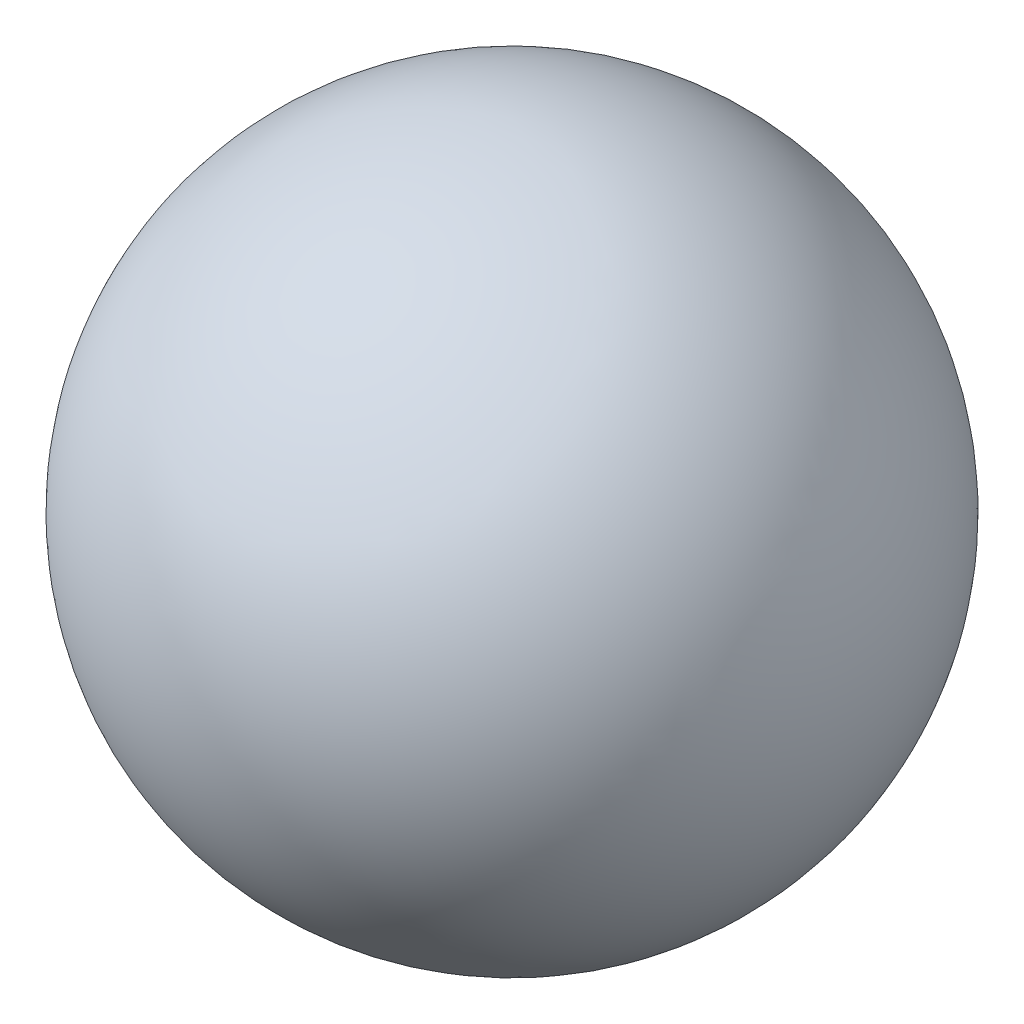
ISO-10303-21;
HEADER;
FILE_DESCRIPTION(('STEP AP214'),'2;1');
FILE_NAME('part.step','',(''),(''),'','','');
FILE_SCHEMA(('AUTOMOTIVE_DESIGN { 1 0 10303 214 1 1 1 1 }'));
ENDSEC;
DATA;
#1=APPLICATION_CONTEXT('core data for automotive mechanical design processes');
#2=APPLICATION_PROTOCOL_DEFINITION('international standard','automotive_design',2000,#1);
#3=PRODUCT_CONTEXT('',#1,'mechanical');
#4=PRODUCT('Part','Part','',(#3));
#5=PRODUCT_RELATED_PRODUCT_CATEGORY('part','',(#4));
#6=PRODUCT_DEFINITION_FORMATION('','',#4);
#7=PRODUCT_DEFINITION_CONTEXT('part definition',#1,'design');
#8=PRODUCT_DEFINITION('design','',#6,#7);
#9=PRODUCT_DEFINITION_SHAPE('','',#8);
#10=(LENGTH_UNIT() NAMED_UNIT(*) SI_UNIT(.MILLI.,.METRE.));
#11=(NAMED_UNIT(*) PLANE_ANGLE_UNIT() SI_UNIT($,.RADIAN.));
#12=(NAMED_UNIT(*) SI_UNIT($,.STERADIAN.) SOLID_ANGLE_UNIT());
#13=UNCERTAINTY_MEASURE_WITH_UNIT(LENGTH_MEASURE(1.E-05),#10,'distance_accuracy_value','');
#14=(GEOMETRIC_REPRESENTATION_CONTEXT(3) GLOBAL_UNCERTAINTY_ASSIGNED_CONTEXT((#13)) GLOBAL_UNIT_ASSIGNED_CONTEXT((#10,
#11,#12)) REPRESENTATION_CONTEXT('',''));
#15=CARTESIAN_POINT('',(0.,0.,0.));
#16=DIRECTION('',(0.,0.,1.));
#17=DIRECTION('',(1.,0.,0.));
#18=AXIS2_PLACEMENT_3D('',#15,#16,#17);
#19=CARTESIAN_POINT('',(0.,0.,0.));
#20=DIRECTION('',(-1.,0.,0.));
#21=DIRECTION('',(0.,0.,-1.));
#22=AXIS2_PLACEMENT_3D('',#19,#20,#21);
#23=SPHERICAL_SURFACE('',#22,210348.45);
#24=CARTESIAN_POINT('',(-210348.45,0.,0.));
#25=VERTEX_POINT('',#24);
#26=VERTEX_LOOP('',#25);
#27=FACE_BOUND('',#26,.T.);
#28=ADVANCED_FACE('F33',(#27),#23,.T.);
#29=CLOSED_SHELL('',(#28));
#30=MANIFOLD_SOLID_BREP('B2',#29);
#31=ADVANCED_BREP_SHAPE_REPRESENTATION('',(#18,#30),#14);
#32=SHAPE_DEFINITION_REPRESENTATION(#9,#31);
ENDSEC;
END-ISO-10303-21;
